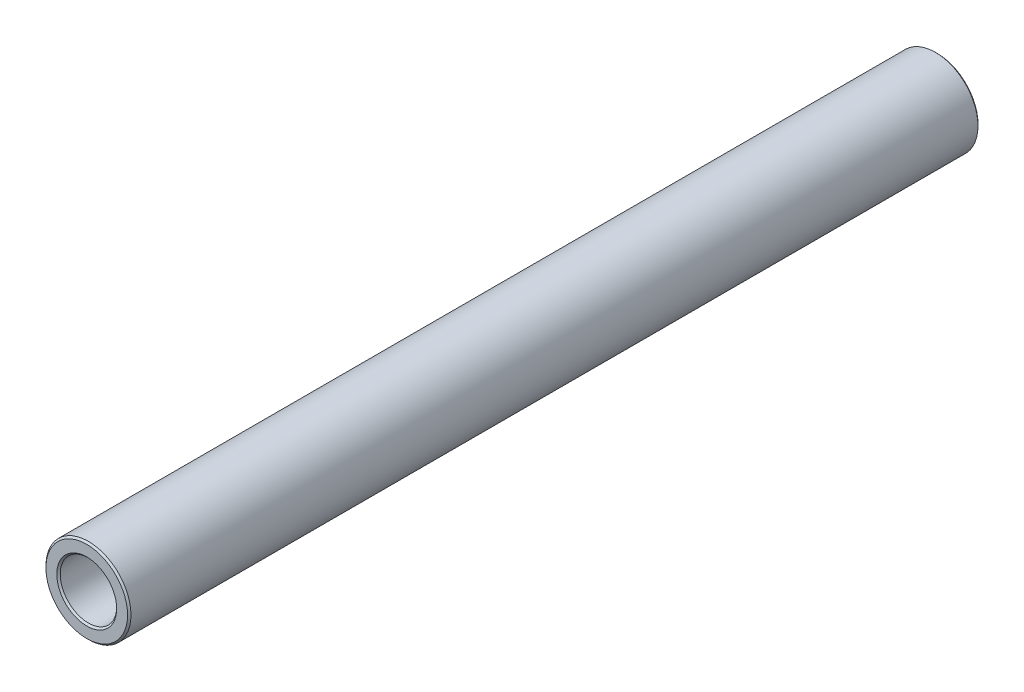
ISO-10303-21;
HEADER;
FILE_DESCRIPTION(('STEP AP214'),'2;1');
FILE_NAME('part.step','',(''),(''),'','','');
FILE_SCHEMA(('AUTOMOTIVE_DESIGN { 1 0 10303 214 1 1 1 1 }'));
ENDSEC;
DATA;
#1=APPLICATION_CONTEXT('core data for automotive mechanical design processes');
#2=APPLICATION_PROTOCOL_DEFINITION('international standard','automotive_design',2000,#1);
#3=PRODUCT_CONTEXT('',#1,'mechanical');
#4=PRODUCT('Part','Part','',(#3));
#5=PRODUCT_RELATED_PRODUCT_CATEGORY('part','',(#4));
#6=PRODUCT_DEFINITION_FORMATION('','',#4);
#7=PRODUCT_DEFINITION_CONTEXT('part definition',#1,'design');
#8=PRODUCT_DEFINITION('design','',#6,#7);
#9=PRODUCT_DEFINITION_SHAPE('','',#8);
#10=(LENGTH_UNIT() NAMED_UNIT(*) SI_UNIT(.MILLI.,.METRE.));
#11=(NAMED_UNIT(*) PLANE_ANGLE_UNIT() SI_UNIT($,.RADIAN.));
#12=(NAMED_UNIT(*) SI_UNIT($,.STERADIAN.) SOLID_ANGLE_UNIT());
#13=UNCERTAINTY_MEASURE_WITH_UNIT(LENGTH_MEASURE(1.E-05),#10,'distance_accuracy_value','');
#14=(GEOMETRIC_REPRESENTATION_CONTEXT(3) GLOBAL_UNCERTAINTY_ASSIGNED_CONTEXT((#13)) GLOBAL_UNIT_ASSIGNED_CONTEXT((#10,
#11,#12)) REPRESENTATION_CONTEXT('',''));
#15=CARTESIAN_POINT('',(0.,0.,0.));
#16=DIRECTION('',(0.,0.,1.));
#17=DIRECTION('',(1.,0.,0.));
#18=AXIS2_PLACEMENT_3D('',#15,#16,#17);
#19=CARTESIAN_POINT('',(0.,0.,63.5));
#20=DIRECTION('',(0.,0.,1.));
#21=DIRECTION('',(1.,0.,0.));
#22=AXIS2_PLACEMENT_3D('',#19,#20,#21);
#23=PLANE('',#22);
#24=CARTESIAN_POINT('',(0.,0.,63.5));
#25=DIRECTION('',(0.,0.,1.));
#26=DIRECTION('',(1.,0.,0.));
#27=AXIS2_PLACEMENT_3D('',#24,#25,#26);
#28=CIRCLE('',#27,2.2352);
#29=CARTESIAN_POINT('',(2.2352,0.,63.5));
#30=VERTEX_POINT('',#29);
#31=EDGE_CURVE('E10',#30,#30,#28,.F.);
#32=ORIENTED_EDGE('',*,*,#31,.T.);
#33=EDGE_LOOP('',(#32));
#34=FACE_BOUND('',#33,.T.);
#35=CARTESIAN_POINT('',(0.,0.,63.5));
#36=DIRECTION('',(0.,0.,1.));
#37=DIRECTION('',(1.,0.,0.));
#38=AXIS2_PLACEMENT_3D('',#35,#36,#37);
#39=CIRCLE('',#38,3.048);
#40=CARTESIAN_POINT('',(3.048,0.,63.5));
#41=VERTEX_POINT('',#40);
#42=EDGE_CURVE('E45',#41,#41,#39,.T.);
#43=ORIENTED_EDGE('',*,*,#42,.T.);
#44=EDGE_LOOP('',(#43));
#45=FACE_BOUND('',#44,.T.);
#46=ADVANCED_FACE('F37',(#34,#45),#23,.T.);
#47=CARTESIAN_POINT('',(0.,0.,0.));
#48=DIRECTION('',(0.,0.,1.));
#49=DIRECTION('',(1.,0.,0.));
#50=AXIS2_PLACEMENT_3D('',#47,#48,#49);
#51=PLANE('',#50);
#52=CARTESIAN_POINT('',(0.,0.,0.));
#53=DIRECTION('',(0.,0.,1.));
#54=DIRECTION('',(1.,0.,0.));
#55=AXIS2_PLACEMENT_3D('',#52,#53,#54);
#56=CIRCLE('',#55,2.23519999999999);
#57=CARTESIAN_POINT('',(2.23519999999999,0.,0.));
#58=VERTEX_POINT('',#57);
#59=EDGE_CURVE('E64',#58,#58,#56,.T.);
#60=ORIENTED_EDGE('',*,*,#59,.T.);
#61=EDGE_LOOP('',(#60));
#62=FACE_BOUND('',#61,.T.);
#63=CARTESIAN_POINT('',(0.,0.,0.));
#64=DIRECTION('',(0.,0.,1.));
#65=DIRECTION('',(1.,0.,0.));
#66=AXIS2_PLACEMENT_3D('',#63,#64,#65);
#67=CIRCLE('',#66,3.04800000000001);
#68=CARTESIAN_POINT('',(3.04800000000001,0.,0.));
#69=VERTEX_POINT('',#68);
#70=EDGE_CURVE('E67',#69,#69,#67,.F.);
#71=ORIENTED_EDGE('',*,*,#70,.T.);
#72=EDGE_LOOP('',(#71));
#73=FACE_BOUND('',#72,.T.);
#74=ADVANCED_FACE('F71',(#62,#73),#51,.F.);
#75=CARTESIAN_POINT('',(0.,0.,63.5));
#76=DIRECTION('',(0.,0.,-1.));
#77=DIRECTION('',(-1.,0.,0.));
#78=AXIS2_PLACEMENT_3D('',#75,#76,#77);
#79=CYLINDRICAL_SURFACE('',#78,3.175);
#80=CARTESIAN_POINT('',(0.,0.,0.126999999999988));
#81=DIRECTION('',(0.,0.,1.));
#82=DIRECTION('',(1.,0.,0.));
#83=AXIS2_PLACEMENT_3D('',#80,#81,#82);
#84=CIRCLE('',#83,3.175);
#85=CARTESIAN_POINT('',(3.175,0.,0.126999999999988));
#86=VERTEX_POINT('',#85);
#87=EDGE_CURVE('E49',#86,#86,#84,.T.);
#88=ORIENTED_EDGE('',*,*,#87,.T.);
#89=EDGE_LOOP('',(#88));
#90=FACE_BOUND('',#89,.T.);
#91=CARTESIAN_POINT('',(0.,0.,63.373));
#92=DIRECTION('',(0.,0.,1.));
#93=DIRECTION('',(1.,0.,0.));
#94=AXIS2_PLACEMENT_3D('',#91,#92,#93);
#95=CIRCLE('',#94,3.175);
#96=CARTESIAN_POINT('',(3.175,0.,63.373));
#97=VERTEX_POINT('',#96);
#98=EDGE_CURVE('E53',#97,#97,#95,.F.);
#99=ORIENTED_EDGE('',*,*,#98,.T.);
#100=EDGE_LOOP('',(#99));
#101=FACE_BOUND('',#100,.T.);
#102=ADVANCED_FACE('F81',(#90,#101),#79,.T.);
#103=CARTESIAN_POINT('',(0.,0.,63.5));
#104=DIRECTION('',(0.,0.,-1.));
#105=DIRECTION('',(-1.,0.,0.));
#106=AXIS2_PLACEMENT_3D('',#103,#104,#105);
#107=CYLINDRICAL_SURFACE('',#106,2.1082);
#108=CARTESIAN_POINT('',(0.,0.,0.127000000000002));
#109=DIRECTION('',(0.,0.,1.));
#110=DIRECTION('',(1.,0.,0.));
#111=AXIS2_PLACEMENT_3D('',#108,#109,#110);
#112=CIRCLE('',#111,2.1082);
#113=CARTESIAN_POINT('',(2.1082,0.,0.127000000000002));
#114=VERTEX_POINT('',#113);
#115=EDGE_CURVE('E58',#114,#114,#112,.F.);
#116=ORIENTED_EDGE('',*,*,#115,.T.);
#117=EDGE_LOOP('',(#116));
#118=FACE_BOUND('',#117,.T.);
#119=CARTESIAN_POINT('',(0.,0.,63.373));
#120=DIRECTION('',(0.,0.,1.));
#121=DIRECTION('',(1.,0.,0.));
#122=AXIS2_PLACEMENT_3D('',#119,#120,#121);
#123=CIRCLE('',#122,2.1082);
#124=CARTESIAN_POINT('',(2.1082,0.,63.373));
#125=VERTEX_POINT('',#124);
#126=EDGE_CURVE('E61',#125,#125,#123,.T.);
#127=ORIENTED_EDGE('',*,*,#126,.T.);
#128=EDGE_LOOP('',(#127));
#129=FACE_BOUND('',#128,.T.);
#130=ADVANCED_FACE('F84',(#118,#129),#107,.F.);
#131=CARTESIAN_POINT('',(0.,0.,0.));
#132=DIRECTION('',(0.,0.,-1.));
#133=DIRECTION('',(-1.,0.,0.));
#134=AXIS2_PLACEMENT_3D('',#131,#132,#133);
#135=CONICAL_SURFACE('',#134,2.23519999999999,0.785398163397411);
#136=ORIENTED_EDGE('',*,*,#115,.F.);
#137=EDGE_LOOP('',(#136));
#138=FACE_BOUND('',#137,.T.);
#139=ORIENTED_EDGE('',*,*,#59,.F.);
#140=EDGE_LOOP('',(#139));
#141=FACE_BOUND('',#140,.T.);
#142=ADVANCED_FACE('F77',(#138,#141),#135,.F.);
#143=CARTESIAN_POINT('',(0.,0.,0.126999999999988));
#144=DIRECTION('',(0.,0.,1.));
#145=DIRECTION('',(1.,0.,0.));
#146=AXIS2_PLACEMENT_3D('',#143,#144,#145);
#147=CONICAL_SURFACE('',#146,3.175,0.785398163397457);
#148=ORIENTED_EDGE('',*,*,#70,.F.);
#149=EDGE_LOOP('',(#148));
#150=FACE_BOUND('',#149,.T.);
#151=ORIENTED_EDGE('',*,*,#87,.F.);
#152=EDGE_LOOP('',(#151));
#153=FACE_BOUND('',#152,.T.);
#154=ADVANCED_FACE('F73',(#150,#153),#147,.T.);
#155=CARTESIAN_POINT('',(0.,0.,63.373));
#156=DIRECTION('',(0.,0.,1.));
#157=DIRECTION('',(1.,0.,0.));
#158=AXIS2_PLACEMENT_3D('',#155,#156,#157);
#159=CONICAL_SURFACE('',#158,2.1082,0.785398163397438);
#160=ORIENTED_EDGE('',*,*,#31,.F.);
#161=EDGE_LOOP('',(#160));
#162=FACE_BOUND('',#161,.T.);
#163=ORIENTED_EDGE('',*,*,#126,.F.);
#164=EDGE_LOOP('',(#163));
#165=FACE_BOUND('',#164,.T.);
#166=ADVANCED_FACE('F76',(#162,#165),#159,.F.);
#167=CARTESIAN_POINT('',(0.,0.,63.5));
#168=DIRECTION('',(0.,0.,-1.));
#169=DIRECTION('',(-1.,0.,0.));
#170=AXIS2_PLACEMENT_3D('',#167,#168,#169);
#171=CONICAL_SURFACE('',#170,3.048,0.785398163397404);
#172=ORIENTED_EDGE('',*,*,#98,.F.);
#173=EDGE_LOOP('',(#172));
#174=FACE_BOUND('',#173,.T.);
#175=ORIENTED_EDGE('',*,*,#42,.F.);
#176=EDGE_LOOP('',(#175));
#177=FACE_BOUND('',#176,.T.);
#178=ADVANCED_FACE('F40',(#174,#177),#171,.T.);
#179=CLOSED_SHELL('',(#46,#74,#102,#130,#142,#154,#166,#178));
#180=MANIFOLD_SOLID_BREP('B2',#179);
#181=ADVANCED_BREP_SHAPE_REPRESENTATION('',(#18,#180),#14);
#182=SHAPE_DEFINITION_REPRESENTATION(#9,#181);
ENDSEC;
END-ISO-10303-21;
